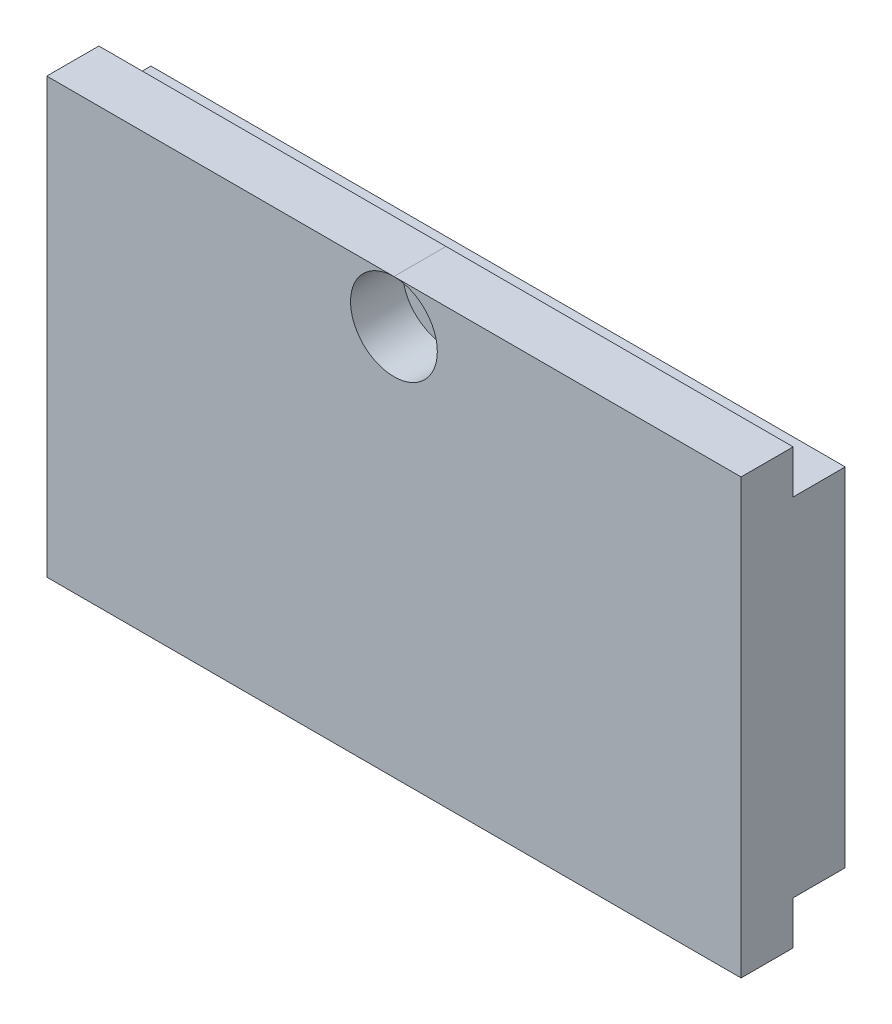
ISO-10303-21;
HEADER;
FILE_DESCRIPTION(('STEP AP214'),'2;1');
FILE_NAME('part.step','',(''),(''),'','','');
FILE_SCHEMA(('AUTOMOTIVE_DESIGN { 1 0 10303 214 1 1 1 1 }'));
ENDSEC;
DATA;
#1=APPLICATION_CONTEXT('core data for automotive mechanical design processes');
#2=APPLICATION_PROTOCOL_DEFINITION('international standard','automotive_design',2000,#1);
#3=PRODUCT_CONTEXT('',#1,'mechanical');
#4=PRODUCT('Part','Part','',(#3));
#5=PRODUCT_RELATED_PRODUCT_CATEGORY('part','',(#4));
#6=PRODUCT_DEFINITION_FORMATION('','',#4);
#7=PRODUCT_DEFINITION_CONTEXT('part definition',#1,'design');
#8=PRODUCT_DEFINITION('design','',#6,#7);
#9=PRODUCT_DEFINITION_SHAPE('','',#8);
#10=(LENGTH_UNIT() NAMED_UNIT(*) SI_UNIT(.MILLI.,.METRE.));
#11=(NAMED_UNIT(*) PLANE_ANGLE_UNIT() SI_UNIT($,.RADIAN.));
#12=(NAMED_UNIT(*) SI_UNIT($,.STERADIAN.) SOLID_ANGLE_UNIT());
#13=UNCERTAINTY_MEASURE_WITH_UNIT(LENGTH_MEASURE(1.E-05),#10,'distance_accuracy_value','');
#14=(GEOMETRIC_REPRESENTATION_CONTEXT(3) GLOBAL_UNCERTAINTY_ASSIGNED_CONTEXT((#13)) GLOBAL_UNIT_ASSIGNED_CONTEXT((#10,
#11,#12)) REPRESENTATION_CONTEXT('',''));
#15=CARTESIAN_POINT('',(0.,0.,0.));
#16=DIRECTION('',(0.,0.,1.));
#17=DIRECTION('',(1.,0.,0.));
#18=AXIS2_PLACEMENT_3D('',#15,#16,#17);
#19=CARTESIAN_POINT('',(0.,20.,6.));
#20=DIRECTION('',(0.,0.,-1.));
#21=DIRECTION('',(1.,0.,0.));
#22=AXIS2_PLACEMENT_3D('',#19,#20,#21);
#23=CYLINDRICAL_SURFACE('',#22,5.);
#24=DIRECTION('',(0.,0.,1.));
#25=VECTOR('',#24,1.);
#26=CARTESIAN_POINT('',(5.,20.,6.));
#27=LINE('',#26,#25);
#28=CARTESIAN_POINT('',(5.,20.,6.));
#29=VERTEX_POINT('',#28);
#30=CARTESIAN_POINT('',(5.,20.,12.));
#31=VERTEX_POINT('',#30);
#32=EDGE_CURVE('E26',#29,#31,#27,.T.);
#33=ORIENTED_EDGE('',*,*,#32,.F.);
#34=CARTESIAN_POINT('',(0.,20.,6.));
#35=DIRECTION('',(0.,0.,1.));
#36=DIRECTION('',(1.,0.,0.));
#37=AXIS2_PLACEMENT_3D('',#34,#35,#36);
#38=CIRCLE('',#37,5.);
#39=CARTESIAN_POINT('',(-5.,20.,6.));
#40=VERTEX_POINT('',#39);
#41=EDGE_CURVE('E279',#40,#29,#38,.T.);
#42=ORIENTED_EDGE('',*,*,#41,.F.);
#43=CARTESIAN_POINT('',(0.,20.,6.));
#44=DIRECTION('',(0.,0.,1.));
#45=DIRECTION('',(1.,0.,0.));
#46=AXIS2_PLACEMENT_3D('',#43,#44,#45);
#47=CIRCLE('',#46,5.);
#48=CARTESIAN_POINT('',(0.,25.,6.));
#49=VERTEX_POINT('',#48);
#50=EDGE_CURVE('E283',#49,#40,#47,.T.);
#51=ORIENTED_EDGE('',*,*,#50,.F.);
#52=DIRECTION('',(0.,0.,-1.));
#53=VECTOR('',#52,1.);
#54=CARTESIAN_POINT('',(0.,25.,6.));
#55=LINE('',#54,#53);
#56=CARTESIAN_POINT('',(0.,25.,12.));
#57=VERTEX_POINT('',#56);
#58=EDGE_CURVE('E10',#57,#49,#55,.T.);
#59=ORIENTED_EDGE('',*,*,#58,.F.);
#60=CARTESIAN_POINT('',(0.,20.,12.));
#61=DIRECTION('',(0.,0.,-1.));
#62=DIRECTION('',(1.,0.,0.));
#63=AXIS2_PLACEMENT_3D('',#60,#61,#62);
#64=CIRCLE('',#63,5.);
#65=EDGE_CURVE('E20',#31,#57,#64,.T.);
#66=ORIENTED_EDGE('',*,*,#65,.F.);
#67=EDGE_LOOP('',(#33,#42,#51,#59,#66));
#68=FACE_BOUND('',#67,.T.);
#69=ADVANCED_FACE('F16',(#68),#23,.F.);
#70=CARTESIAN_POINT('',(0.,20.,6.));
#71=DIRECTION('',(0.,0.,-1.));
#72=DIRECTION('',(1.,0.,0.));
#73=AXIS2_PLACEMENT_3D('',#70,#71,#72);
#74=CYLINDRICAL_SURFACE('',#73,5.);
#75=CARTESIAN_POINT('',(0.,20.,6.));
#76=DIRECTION('',(0.,0.,1.));
#77=DIRECTION('',(1.,0.,0.));
#78=AXIS2_PLACEMENT_3D('',#75,#76,#77);
#79=CIRCLE('',#78,5.);
#80=EDGE_CURVE('E271',#29,#49,#79,.T.);
#81=ORIENTED_EDGE('',*,*,#80,.F.);
#82=ORIENTED_EDGE('',*,*,#32,.T.);
#83=CARTESIAN_POINT('',(0.,20.,12.));
#84=DIRECTION('',(0.,0.,-1.));
#85=DIRECTION('',(1.,0.,0.));
#86=AXIS2_PLACEMENT_3D('',#83,#84,#85);
#87=CIRCLE('',#86,5.);
#88=EDGE_CURVE('E201',#57,#31,#87,.T.);
#89=ORIENTED_EDGE('',*,*,#88,.F.);
#90=ORIENTED_EDGE('',*,*,#58,.T.);
#91=EDGE_LOOP('',(#81,#82,#89,#90));
#92=FACE_BOUND('',#91,.T.);
#93=ADVANCED_FACE('F18',(#92),#74,.F.);
#94=CARTESIAN_POINT('',(0.,0.,6.));
#95=DIRECTION('',(0.,0.,1.));
#96=DIRECTION('',(1.,0.,0.));
#97=AXIS2_PLACEMENT_3D('',#94,#95,#96);
#98=PLANE('',#97);
#99=CARTESIAN_POINT('',(20.,0.,6.));
#100=DIRECTION('',(0.,0.,-1.));
#101=DIRECTION('',(1.,0.,0.));
#102=AXIS2_PLACEMENT_3D('',#99,#100,#101);
#103=CIRCLE('',#102,3.);
#104=CARTESIAN_POINT('',(23.,0.,6.));
#105=VERTEX_POINT('',#104);
#106=EDGE_CURVE('E265',#105,#105,#103,.T.);
#107=ORIENTED_EDGE('',*,*,#106,.T.);
#108=EDGE_LOOP('',(#107));
#109=FACE_BOUND('',#108,.T.);
#110=ADVANCED_FACE('F340',(#109),#98,.F.);
#111=CARTESIAN_POINT('',(0.,0.,6.));
#112=DIRECTION('',(0.,0.,1.));
#113=DIRECTION('',(1.,0.,0.));
#114=AXIS2_PLACEMENT_3D('',#111,#112,#113);
#115=PLANE('',#114);
#116=CARTESIAN_POINT('',(-20.,0.,6.));
#117=DIRECTION('',(0.,0.,-1.));
#118=DIRECTION('',(1.,0.,0.));
#119=AXIS2_PLACEMENT_3D('',#116,#117,#118);
#120=CIRCLE('',#119,3.);
#121=CARTESIAN_POINT('',(-17.,0.,6.));
#122=VERTEX_POINT('',#121);
#123=EDGE_CURVE('E258',#122,#122,#120,.T.);
#124=ORIENTED_EDGE('',*,*,#123,.T.);
#125=EDGE_LOOP('',(#124));
#126=FACE_BOUND('',#125,.T.);
#127=ADVANCED_FACE('F357',(#126),#115,.F.);
#128=CARTESIAN_POINT('',(40.,25.,6.));
#129=DIRECTION('',(0.,-1.,0.));
#130=DIRECTION('',(0.,0.,-1.));
#131=AXIS2_PLACEMENT_3D('',#128,#129,#130);
#132=PLANE('',#131);
#133=EDGE_CURVE('E28',#57,#49,#55,.T.);
#134=ORIENTED_EDGE('',*,*,#133,.F.);
#135=DIRECTION('',(-1.,0.,0.));
#136=VECTOR('',#135,1.);
#137=CARTESIAN_POINT('',(40.,25.,12.));
#138=LINE('',#137,#136);
#139=CARTESIAN_POINT('',(40.,25.,12.));
#140=VERTEX_POINT('',#139);
#141=EDGE_CURVE('E205',#140,#57,#138,.T.);
#142=ORIENTED_EDGE('',*,*,#141,.F.);
#143=DIRECTION('',(0.,0.,1.));
#144=VECTOR('',#143,1.);
#145=CARTESIAN_POINT('',(40.,25.,6.));
#146=LINE('',#145,#144);
#147=CARTESIAN_POINT('',(40.,25.,6.));
#148=VERTEX_POINT('',#147);
#149=EDGE_CURVE('E199',#148,#140,#146,.T.);
#150=ORIENTED_EDGE('',*,*,#149,.F.);
#151=DIRECTION('',(-1.,0.,0.));
#152=VECTOR('',#151,1.);
#153=CARTESIAN_POINT('',(40.,25.,6.));
#154=LINE('',#153,#152);
#155=EDGE_CURVE('E275',#148,#49,#154,.T.);
#156=ORIENTED_EDGE('',*,*,#155,.T.);
#157=EDGE_LOOP('',(#134,#142,#150,#156));
#158=FACE_BOUND('',#157,.T.);
#159=ADVANCED_FACE('F320',(#158),#132,.F.);
#160=CARTESIAN_POINT('',(0.,0.,12.));
#161=DIRECTION('',(0.,0.,1.));
#162=DIRECTION('',(1.,0.,0.));
#163=AXIS2_PLACEMENT_3D('',#160,#161,#162);
#164=PLANE('',#163);
#165=DIRECTION('',(0.,-1.,0.));
#166=VECTOR('',#165,1.);
#167=CARTESIAN_POINT('',(-40.,25.,12.));
#168=LINE('',#167,#166);
#169=CARTESIAN_POINT('',(-40.,25.,12.));
#170=VERTEX_POINT('',#169);
#171=CARTESIAN_POINT('',(-40.,-25.,12.));
#172=VERTEX_POINT('',#171);
#173=EDGE_CURVE('E178',#170,#172,#168,.T.);
#174=ORIENTED_EDGE('',*,*,#173,.T.);
#175=DIRECTION('',(1.,0.,0.));
#176=VECTOR('',#175,1.);
#177=CARTESIAN_POINT('',(-40.,-25.,12.));
#178=LINE('',#177,#176);
#179=CARTESIAN_POINT('',(40.,-25.,12.));
#180=VERTEX_POINT('',#179);
#181=EDGE_CURVE('E268',#172,#180,#178,.T.);
#182=ORIENTED_EDGE('',*,*,#181,.T.);
#183=DIRECTION('',(0.,1.,0.));
#184=VECTOR('',#183,1.);
#185=CARTESIAN_POINT('',(40.,-25.,12.));
#186=LINE('',#185,#184);
#187=EDGE_CURVE('E227',#180,#140,#186,.T.);
#188=ORIENTED_EDGE('',*,*,#187,.T.);
#189=ORIENTED_EDGE('',*,*,#141,.T.);
#190=ORIENTED_EDGE('',*,*,#88,.T.);
#191=ORIENTED_EDGE('',*,*,#65,.T.);
#192=DIRECTION('',(-1.,0.,0.));
#193=VECTOR('',#192,1.);
#194=CARTESIAN_POINT('',(40.,25.,12.));
#195=LINE('',#194,#193);
#196=EDGE_CURVE('E254',#57,#170,#195,.T.);
#197=ORIENTED_EDGE('',*,*,#196,.T.);
#198=EDGE_LOOP('',(#174,#182,#188,#189,#190,#191,#197));
#199=FACE_BOUND('',#198,.T.);
#200=ADVANCED_FACE('F298',(#199),#164,.T.);
#201=CARTESIAN_POINT('',(40.,25.,6.));
#202=DIRECTION('',(0.,-1.,0.));
#203=DIRECTION('',(0.,0.,-1.));
#204=AXIS2_PLACEMENT_3D('',#201,#202,#203);
#205=PLANE('',#204);
#206=DIRECTION('',(0.,0.,1.));
#207=VECTOR('',#206,1.);
#208=CARTESIAN_POINT('',(-40.,25.,6.));
#209=LINE('',#208,#207);
#210=CARTESIAN_POINT('',(-40.,25.,6.));
#211=VERTEX_POINT('',#210);
#212=EDGE_CURVE('E215',#211,#170,#209,.T.);
#213=ORIENTED_EDGE('',*,*,#212,.T.);
#214=ORIENTED_EDGE('',*,*,#196,.F.);
#215=ORIENTED_EDGE('',*,*,#133,.T.);
#216=DIRECTION('',(-1.,0.,0.));
#217=VECTOR('',#216,1.);
#218=CARTESIAN_POINT('',(40.,25.,6.));
#219=LINE('',#218,#217);
#220=EDGE_CURVE('E286',#49,#211,#219,.T.);
#221=ORIENTED_EDGE('',*,*,#220,.T.);
#222=EDGE_LOOP('',(#213,#214,#215,#221));
#223=FACE_BOUND('',#222,.T.);
#224=ADVANCED_FACE('F304',(#223),#205,.F.);
#225=CARTESIAN_POINT('',(0.,0.,6.));
#226=DIRECTION('',(0.,0.,1.));
#227=DIRECTION('',(1.,0.,0.));
#228=AXIS2_PLACEMENT_3D('',#225,#226,#227);
#229=PLANE('',#228);
#230=ORIENTED_EDGE('',*,*,#50,.T.);
#231=DIRECTION('',(-1.,0.,0.));
#232=VECTOR('',#231,1.);
#233=CARTESIAN_POINT('',(40.,20.,6.));
#234=LINE('',#233,#232);
#235=CARTESIAN_POINT('',(-40.,20.,6.));
#236=VERTEX_POINT('',#235);
#237=EDGE_CURVE('E211',#40,#236,#234,.T.);
#238=ORIENTED_EDGE('',*,*,#237,.T.);
#239=DIRECTION('',(0.,-1.,0.));
#240=VECTOR('',#239,1.);
#241=CARTESIAN_POINT('',(-40.,25.,6.));
#242=LINE('',#241,#240);
#243=EDGE_CURVE('E219',#211,#236,#242,.T.);
#244=ORIENTED_EDGE('',*,*,#243,.F.);
#245=ORIENTED_EDGE('',*,*,#220,.F.);
#246=EDGE_LOOP('',(#230,#238,#244,#245));
#247=FACE_BOUND('',#246,.T.);
#248=ADVANCED_FACE('F324',(#247),#229,.F.);
#249=CARTESIAN_POINT('',(0.,0.,6.));
#250=DIRECTION('',(0.,0.,1.));
#251=DIRECTION('',(1.,0.,0.));
#252=AXIS2_PLACEMENT_3D('',#249,#250,#251);
#253=PLANE('',#252);
#254=DIRECTION('',(-1.,0.,0.));
#255=VECTOR('',#254,1.);
#256=CARTESIAN_POINT('',(40.,20.,6.));
#257=LINE('',#256,#255);
#258=EDGE_CURVE('E206',#29,#40,#257,.T.);
#259=ORIENTED_EDGE('',*,*,#258,.T.);
#260=ORIENTED_EDGE('',*,*,#41,.T.);
#261=EDGE_LOOP('',(#259,#260));
#262=FACE_BOUND('',#261,.T.);
#263=ADVANCED_FACE('F317',(#262),#253,.T.);
#264=CARTESIAN_POINT('',(0.,0.,6.));
#265=DIRECTION('',(0.,0.,1.));
#266=DIRECTION('',(1.,0.,0.));
#267=AXIS2_PLACEMENT_3D('',#264,#265,#266);
#268=PLANE('',#267);
#269=DIRECTION('',(0.,1.,0.));
#270=VECTOR('',#269,1.);
#271=CARTESIAN_POINT('',(40.,-25.,6.));
#272=LINE('',#271,#270);
#273=CARTESIAN_POINT('',(40.,20.,6.));
#274=VERTEX_POINT('',#273);
#275=EDGE_CURVE('E184',#274,#148,#272,.T.);
#276=ORIENTED_EDGE('',*,*,#275,.F.);
#277=DIRECTION('',(-1.,0.,0.));
#278=VECTOR('',#277,1.);
#279=CARTESIAN_POINT('',(40.,20.,6.));
#280=LINE('',#279,#278);
#281=EDGE_CURVE('E210',#274,#29,#280,.T.);
#282=ORIENTED_EDGE('',*,*,#281,.T.);
#283=ORIENTED_EDGE('',*,*,#80,.T.);
#284=ORIENTED_EDGE('',*,*,#155,.F.);
#285=EDGE_LOOP('',(#276,#282,#283,#284));
#286=FACE_BOUND('',#285,.T.);
#287=ADVANCED_FACE('F311',(#286),#268,.F.);
#288=CARTESIAN_POINT('',(-40.,-25.,6.));
#289=DIRECTION('',(0.,1.,0.));
#290=DIRECTION('',(1.,0.,0.));
#291=AXIS2_PLACEMENT_3D('',#288,#289,#290);
#292=PLANE('',#291);
#293=DIRECTION('',(1.,0.,0.));
#294=VECTOR('',#293,1.);
#295=CARTESIAN_POINT('',(-40.,-25.,6.));
#296=LINE('',#295,#294);
#297=CARTESIAN_POINT('',(-40.,-25.,6.));
#298=VERTEX_POINT('',#297);
#299=CARTESIAN_POINT('',(40.,-25.,6.));
#300=VERTEX_POINT('',#299);
#301=EDGE_CURVE('E243',#298,#300,#296,.T.);
#302=ORIENTED_EDGE('',*,*,#301,.T.);
#303=DIRECTION('',(0.,0.,1.));
#304=VECTOR('',#303,1.);
#305=CARTESIAN_POINT('',(40.,-25.,6.));
#306=LINE('',#305,#304);
#307=EDGE_CURVE('E231',#300,#180,#306,.T.);
#308=ORIENTED_EDGE('',*,*,#307,.T.);
#309=ORIENTED_EDGE('',*,*,#181,.F.);
#310=DIRECTION('',(0.,0.,1.));
#311=VECTOR('',#310,1.);
#312=CARTESIAN_POINT('',(-40.,-25.,6.));
#313=LINE('',#312,#311);
#314=EDGE_CURVE('E176',#298,#172,#313,.T.);
#315=ORIENTED_EDGE('',*,*,#314,.F.);
#316=EDGE_LOOP('',(#302,#308,#309,#315));
#317=FACE_BOUND('',#316,.T.);
#318=ADVANCED_FACE('F348',(#317),#292,.F.);
#319=CARTESIAN_POINT('',(20.,0.,0.));
#320=DIRECTION('',(0.,0.,-1.));
#321=DIRECTION('',(1.,0.,0.));
#322=AXIS2_PLACEMENT_3D('',#319,#320,#321);
#323=CYLINDRICAL_SURFACE('',#322,3.);
#324=CARTESIAN_POINT('',(20.,0.,0.));
#325=DIRECTION('',(0.,0.,1.));
#326=DIRECTION('',(1.,0.,0.));
#327=AXIS2_PLACEMENT_3D('',#324,#325,#326);
#328=CIRCLE('',#327,3.);
#329=CARTESIAN_POINT('',(23.,0.,0.));
#330=VERTEX_POINT('',#329);
#331=EDGE_CURVE('E194',#330,#330,#328,.T.);
#332=ORIENTED_EDGE('',*,*,#331,.F.);
#333=DIRECTION('',(0.,0.,1.));
#334=VECTOR('',#333,1.);
#335=CARTESIAN_POINT('',(23.,0.,0.));
#336=LINE('',#335,#334);
#337=EDGE_CURVE('E261',#330,#105,#336,.T.);
#338=ORIENTED_EDGE('',*,*,#337,.T.);
#339=ORIENTED_EDGE('',*,*,#106,.F.);
#340=ORIENTED_EDGE('',*,*,#337,.F.);
#341=EDGE_LOOP('',(#332,#338,#339,#340));
#342=FACE_BOUND('',#341,.T.);
#343=ADVANCED_FACE('F355',(#342),#323,.F.);
#344=CARTESIAN_POINT('',(-20.,0.,0.));
#345=DIRECTION('',(0.,0.,-1.));
#346=DIRECTION('',(1.,0.,0.));
#347=AXIS2_PLACEMENT_3D('',#344,#345,#346);
#348=CYLINDRICAL_SURFACE('',#347,3.);
#349=CARTESIAN_POINT('',(-20.,0.,0.));
#350=DIRECTION('',(0.,0.,1.));
#351=DIRECTION('',(1.,0.,0.));
#352=AXIS2_PLACEMENT_3D('',#349,#350,#351);
#353=CIRCLE('',#352,3.);
#354=CARTESIAN_POINT('',(-17.,0.,0.));
#355=VERTEX_POINT('',#354);
#356=EDGE_CURVE('E191',#355,#355,#353,.T.);
#357=ORIENTED_EDGE('',*,*,#356,.F.);
#358=DIRECTION('',(0.,0.,1.));
#359=VECTOR('',#358,1.);
#360=CARTESIAN_POINT('',(-17.,0.,0.));
#361=LINE('',#360,#359);
#362=EDGE_CURVE('E250',#355,#122,#361,.T.);
#363=ORIENTED_EDGE('',*,*,#362,.T.);
#364=ORIENTED_EDGE('',*,*,#123,.F.);
#365=ORIENTED_EDGE('',*,*,#362,.F.);
#366=EDGE_LOOP('',(#357,#363,#364,#365));
#367=FACE_BOUND('',#366,.T.);
#368=ADVANCED_FACE('F366',(#367),#348,.F.);
#369=CARTESIAN_POINT('',(40.,20.,0.));
#370=DIRECTION('',(0.,-1.,0.));
#371=DIRECTION('',(0.,0.,-1.));
#372=AXIS2_PLACEMENT_3D('',#369,#370,#371);
#373=PLANE('',#372);
#374=DIRECTION('',(-1.,0.,0.));
#375=VECTOR('',#374,1.);
#376=CARTESIAN_POINT('',(40.,20.,0.));
#377=LINE('',#376,#375);
#378=CARTESIAN_POINT('',(40.,20.,0.));
#379=VERTEX_POINT('',#378);
#380=CARTESIAN_POINT('',(-40.,20.,0.));
#381=VERTEX_POINT('',#380);
#382=EDGE_CURVE('E195',#379,#381,#377,.T.);
#383=ORIENTED_EDGE('',*,*,#382,.T.);
#384=DIRECTION('',(0.,0.,1.));
#385=VECTOR('',#384,1.);
#386=CARTESIAN_POINT('',(-40.,20.,0.));
#387=LINE('',#386,#385);
#388=EDGE_CURVE('E149',#381,#236,#387,.T.);
#389=ORIENTED_EDGE('',*,*,#388,.T.);
#390=ORIENTED_EDGE('',*,*,#237,.F.);
#391=ORIENTED_EDGE('',*,*,#258,.F.);
#392=ORIENTED_EDGE('',*,*,#281,.F.);
#393=DIRECTION('',(0.,0.,1.));
#394=VECTOR('',#393,1.);
#395=CARTESIAN_POINT('',(40.,20.,0.));
#396=LINE('',#395,#394);
#397=EDGE_CURVE('E180',#379,#274,#396,.T.);
#398=ORIENTED_EDGE('',*,*,#397,.F.);
#399=EDGE_LOOP('',(#383,#389,#390,#391,#392,#398));
#400=FACE_BOUND('',#399,.T.);
#401=ADVANCED_FACE('F315',(#400),#373,.F.);
#402=CARTESIAN_POINT('',(0.,0.,6.));
#403=DIRECTION('',(0.,0.,1.));
#404=DIRECTION('',(1.,0.,0.));
#405=AXIS2_PLACEMENT_3D('',#402,#403,#404);
#406=PLANE('',#405);
#407=DIRECTION('',(0.,1.,0.));
#408=VECTOR('',#407,1.);
#409=CARTESIAN_POINT('',(40.,-25.,6.));
#410=LINE('',#409,#408);
#411=CARTESIAN_POINT('',(40.,-20.,6.));
#412=VERTEX_POINT('',#411);
#413=EDGE_CURVE('E235',#300,#412,#410,.T.);
#414=ORIENTED_EDGE('',*,*,#413,.F.);
#415=ORIENTED_EDGE('',*,*,#301,.F.);
#416=DIRECTION('',(0.,-1.,0.));
#417=VECTOR('',#416,1.);
#418=CARTESIAN_POINT('',(-40.,25.,6.));
#419=LINE('',#418,#417);
#420=CARTESIAN_POINT('',(-40.,-20.,6.));
#421=VERTEX_POINT('',#420);
#422=EDGE_CURVE('E153',#421,#298,#419,.T.);
#423=ORIENTED_EDGE('',*,*,#422,.F.);
#424=DIRECTION('',(1.,0.,0.));
#425=VECTOR('',#424,1.);
#426=CARTESIAN_POINT('',(-40.,-20.,6.));
#427=LINE('',#426,#425);
#428=EDGE_CURVE('E161',#421,#412,#427,.T.);
#429=ORIENTED_EDGE('',*,*,#428,.T.);
#430=EDGE_LOOP('',(#414,#415,#423,#429));
#431=FACE_BOUND('',#430,.T.);
#432=ADVANCED_FACE('F351',(#431),#406,.F.);
#433=CARTESIAN_POINT('',(0.,0.,0.));
#434=DIRECTION('',(0.,0.,1.));
#435=DIRECTION('',(1.,0.,0.));
#436=AXIS2_PLACEMENT_3D('',#433,#434,#435);
#437=PLANE('',#436);
#438=ORIENTED_EDGE('',*,*,#331,.T.);
#439=EDGE_LOOP('',(#438));
#440=FACE_BOUND('',#439,.T.);
#441=ORIENTED_EDGE('',*,*,#356,.T.);
#442=EDGE_LOOP('',(#441));
#443=FACE_BOUND('',#442,.T.);
#444=DIRECTION('',(0.,-1.,0.));
#445=VECTOR('',#444,1.);
#446=CARTESIAN_POINT('',(-40.,20.,0.));
#447=LINE('',#446,#445);
#448=CARTESIAN_POINT('',(-40.,-20.,0.));
#449=VERTEX_POINT('',#448);
#450=EDGE_CURVE('E141',#381,#449,#447,.T.);
#451=ORIENTED_EDGE('',*,*,#450,.F.);
#452=ORIENTED_EDGE('',*,*,#382,.F.);
#453=DIRECTION('',(0.,1.,0.));
#454=VECTOR('',#453,1.);
#455=CARTESIAN_POINT('',(40.,-20.,0.));
#456=LINE('',#455,#454);
#457=CARTESIAN_POINT('',(40.,-20.,0.));
#458=VERTEX_POINT('',#457);
#459=EDGE_CURVE('E166',#458,#379,#456,.T.);
#460=ORIENTED_EDGE('',*,*,#459,.F.);
#461=DIRECTION('',(1.,0.,0.));
#462=VECTOR('',#461,1.);
#463=CARTESIAN_POINT('',(-40.,-20.,0.));
#464=LINE('',#463,#462);
#465=EDGE_CURVE('E159',#449,#458,#464,.T.);
#466=ORIENTED_EDGE('',*,*,#465,.F.);
#467=EDGE_LOOP('',(#451,#452,#460,#466));
#468=FACE_BOUND('',#467,.T.);
#469=ADVANCED_FACE('F164',(#440,#443,#468),#437,.F.);
#470=CARTESIAN_POINT('',(40.,-20.,0.));
#471=DIRECTION('',(-1.,0.,0.));
#472=DIRECTION('',(0.,0.,1.));
#473=AXIS2_PLACEMENT_3D('',#470,#471,#472);
#474=PLANE('',#473);
#475=ORIENTED_EDGE('',*,*,#459,.T.);
#476=ORIENTED_EDGE('',*,*,#397,.T.);
#477=ORIENTED_EDGE('',*,*,#275,.T.);
#478=ORIENTED_EDGE('',*,*,#149,.T.);
#479=ORIENTED_EDGE('',*,*,#187,.F.);
#480=ORIENTED_EDGE('',*,*,#307,.F.);
#481=ORIENTED_EDGE('',*,*,#413,.T.);
#482=DIRECTION('',(0.,0.,1.));
#483=VECTOR('',#482,1.);
#484=CARTESIAN_POINT('',(40.,-20.,0.));
#485=LINE('',#484,#483);
#486=EDGE_CURVE('E169',#458,#412,#485,.T.);
#487=ORIENTED_EDGE('',*,*,#486,.F.);
#488=EDGE_LOOP('',(#475,#476,#477,#478,#479,#480,#481,#487));
#489=FACE_BOUND('',#488,.T.);
#490=ADVANCED_FACE('F322',(#489),#474,.F.);
#491=CARTESIAN_POINT('',(-40.,20.,0.));
#492=DIRECTION('',(1.,0.,0.));
#493=DIRECTION('',(0.,1.,0.));
#494=AXIS2_PLACEMENT_3D('',#491,#492,#493);
#495=PLANE('',#494);
#496=ORIENTED_EDGE('',*,*,#450,.T.);
#497=DIRECTION('',(0.,0.,1.));
#498=VECTOR('',#497,1.);
#499=CARTESIAN_POINT('',(-40.,-20.,0.));
#500=LINE('',#499,#498);
#501=EDGE_CURVE('E145',#449,#421,#500,.T.);
#502=ORIENTED_EDGE('',*,*,#501,.T.);
#503=ORIENTED_EDGE('',*,*,#422,.T.);
#504=ORIENTED_EDGE('',*,*,#314,.T.);
#505=ORIENTED_EDGE('',*,*,#173,.F.);
#506=ORIENTED_EDGE('',*,*,#212,.F.);
#507=ORIENTED_EDGE('',*,*,#243,.T.);
#508=ORIENTED_EDGE('',*,*,#388,.F.);
#509=EDGE_LOOP('',(#496,#502,#503,#504,#505,#506,#507,#508));
#510=FACE_BOUND('',#509,.T.);
#511=ADVANCED_FACE('F143',(#510),#495,.F.);
#512=CARTESIAN_POINT('',(-40.,-20.,0.));
#513=DIRECTION('',(0.,1.,0.));
#514=DIRECTION('',(1.,0.,0.));
#515=AXIS2_PLACEMENT_3D('',#512,#513,#514);
#516=PLANE('',#515);
#517=ORIENTED_EDGE('',*,*,#465,.T.);
#518=ORIENTED_EDGE('',*,*,#486,.T.);
#519=ORIENTED_EDGE('',*,*,#428,.F.);
#520=ORIENTED_EDGE('',*,*,#501,.F.);
#521=EDGE_LOOP('',(#517,#518,#519,#520));
#522=FACE_BOUND('',#521,.T.);
#523=ADVANCED_FACE('F157',(#522),#516,.F.);
#524=CLOSED_SHELL('',(#69,#93,#110,#127,#159,#200,#224,#248,#263,#287,#318,#343,#368,#401,#432,
#469,#490,#511,#523));
#525=MANIFOLD_SOLID_BREP('B1',#524);
#526=ADVANCED_BREP_SHAPE_REPRESENTATION('',(#18,#525),#14);
#527=SHAPE_DEFINITION_REPRESENTATION(#9,#526);
ENDSEC;
END-ISO-10303-21;
